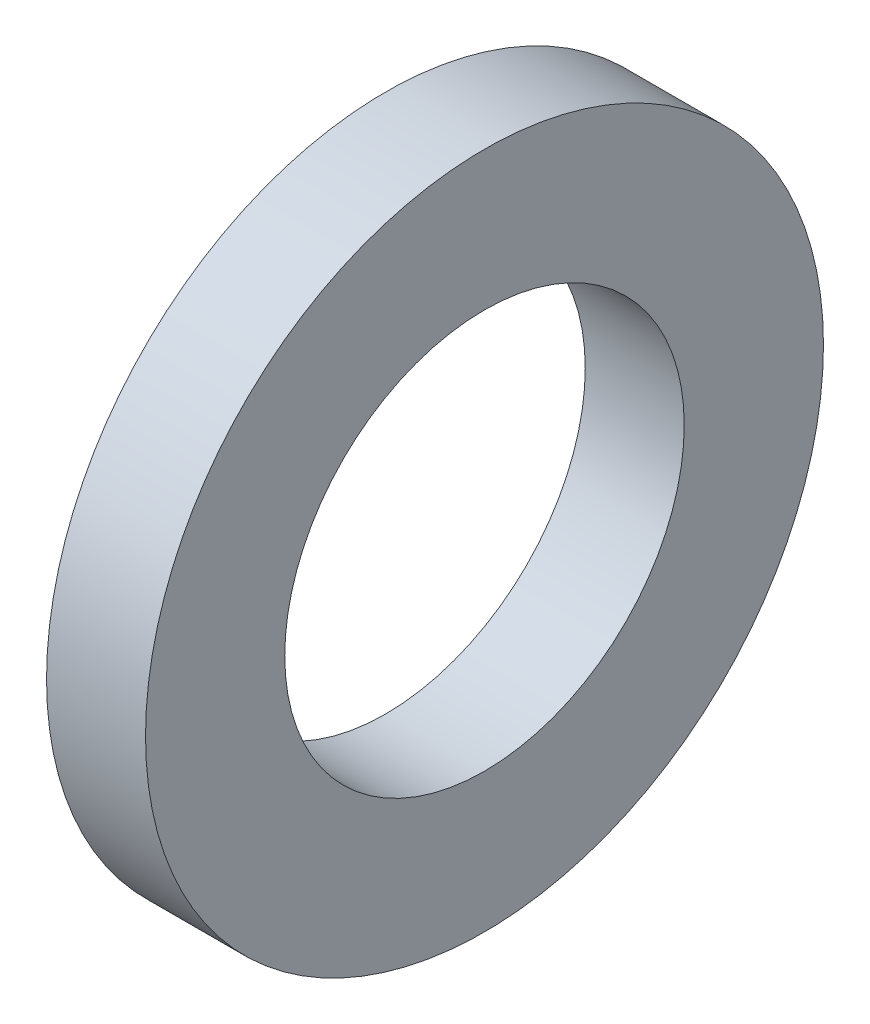
ISO-10303-21;
HEADER;
FILE_DESCRIPTION(('STEP AP214'),'2;1');
FILE_NAME('part.step','',(''),(''),'','','');
FILE_SCHEMA(('AUTOMOTIVE_DESIGN { 1 0 10303 214 1 1 1 1 }'));
ENDSEC;
DATA;
#1=APPLICATION_CONTEXT('core data for automotive mechanical design processes');
#2=APPLICATION_PROTOCOL_DEFINITION('international standard','automotive_design',2000,#1);
#3=PRODUCT_CONTEXT('',#1,'mechanical');
#4=PRODUCT('Part','Part','',(#3));
#5=PRODUCT_RELATED_PRODUCT_CATEGORY('part','',(#4));
#6=PRODUCT_DEFINITION_FORMATION('','',#4);
#7=PRODUCT_DEFINITION_CONTEXT('part definition',#1,'design');
#8=PRODUCT_DEFINITION('design','',#6,#7);
#9=PRODUCT_DEFINITION_SHAPE('','',#8);
#10=(LENGTH_UNIT() NAMED_UNIT(*) SI_UNIT(.MILLI.,.METRE.));
#11=(NAMED_UNIT(*) PLANE_ANGLE_UNIT() SI_UNIT($,.RADIAN.));
#12=(NAMED_UNIT(*) SI_UNIT($,.STERADIAN.) SOLID_ANGLE_UNIT());
#13=UNCERTAINTY_MEASURE_WITH_UNIT(LENGTH_MEASURE(1.E-05),#10,'distance_accuracy_value','');
#14=(GEOMETRIC_REPRESENTATION_CONTEXT(3) GLOBAL_UNCERTAINTY_ASSIGNED_CONTEXT((#13)) GLOBAL_UNIT_ASSIGNED_CONTEXT((#10,
#11,#12)) REPRESENTATION_CONTEXT('',''));
#15=CARTESIAN_POINT('',(0.,0.,0.));
#16=DIRECTION('',(0.,0.,1.));
#17=DIRECTION('',(1.,0.,0.));
#18=AXIS2_PLACEMENT_3D('',#15,#16,#17);
#19=CARTESIAN_POINT('',(1.29794,0.,0.));
#20=DIRECTION('',(1.,0.,0.));
#21=DIRECTION('',(0.,0.,-1.));
#22=AXIS2_PLACEMENT_3D('',#19,#20,#21);
#23=PLANE('',#22);
#24=CARTESIAN_POINT('',(1.29794,0.,0.));
#25=DIRECTION('',(1.,0.,0.));
#26=DIRECTION('',(0.,0.,-1.));
#27=AXIS2_PLACEMENT_3D('',#24,#25,#26);
#28=CIRCLE('',#27,8.89);
#29=CARTESIAN_POINT('',(1.29794,0.,-8.89));
#30=VERTEX_POINT('',#29);
#31=EDGE_CURVE('E10',#30,#30,#28,.T.);
#32=ORIENTED_EDGE('',*,*,#31,.T.);
#33=EDGE_LOOP('',(#32));
#34=FACE_BOUND('',#33,.T.);
#35=CARTESIAN_POINT('',(1.29794,0.,0.));
#36=DIRECTION('',(1.,0.,0.));
#37=DIRECTION('',(0.,0.,-1.));
#38=AXIS2_PLACEMENT_3D('',#35,#36,#37);
#39=CIRCLE('',#38,5.23875);
#40=CARTESIAN_POINT('',(1.29794,0.,-5.23875));
#41=VERTEX_POINT('',#40);
#42=EDGE_CURVE('E56',#41,#41,#39,.T.);
#43=ORIENTED_EDGE('',*,*,#42,.F.);
#44=EDGE_LOOP('',(#43));
#45=FACE_BOUND('',#44,.T.);
#46=ADVANCED_FACE('F43',(#34,#45),#23,.T.);
#47=CARTESIAN_POINT('',(-1.29794,0.,0.));
#48=DIRECTION('',(1.,0.,0.));
#49=DIRECTION('',(0.,0.,-1.));
#50=AXIS2_PLACEMENT_3D('',#47,#48,#49);
#51=PLANE('',#50);
#52=CARTESIAN_POINT('',(-1.29794,0.,0.));
#53=DIRECTION('',(1.,0.,0.));
#54=DIRECTION('',(0.,0.,-1.));
#55=AXIS2_PLACEMENT_3D('',#52,#53,#54);
#56=CIRCLE('',#55,8.89);
#57=CARTESIAN_POINT('',(-1.29794,0.,-8.89));
#58=VERTEX_POINT('',#57);
#59=EDGE_CURVE('E47',#58,#58,#56,.T.);
#60=ORIENTED_EDGE('',*,*,#59,.F.);
#61=EDGE_LOOP('',(#60));
#62=FACE_BOUND('',#61,.T.);
#63=CARTESIAN_POINT('',(-1.29794,0.,0.));
#64=DIRECTION('',(1.,0.,0.));
#65=DIRECTION('',(0.,0.,-1.));
#66=AXIS2_PLACEMENT_3D('',#63,#64,#65);
#67=CIRCLE('',#66,5.23875);
#68=CARTESIAN_POINT('',(-1.29794,0.,-5.23875));
#69=VERTEX_POINT('',#68);
#70=EDGE_CURVE('E58',#69,#69,#67,.T.);
#71=ORIENTED_EDGE('',*,*,#70,.T.);
#72=EDGE_LOOP('',(#71));
#73=FACE_BOUND('',#72,.T.);
#74=ADVANCED_FACE('F70',(#62,#73),#51,.F.);
#75=CARTESIAN_POINT('',(1.29794,0.,0.));
#76=DIRECTION('',(-1.,0.,0.));
#77=DIRECTION('',(0.,0.,1.));
#78=AXIS2_PLACEMENT_3D('',#75,#76,#77);
#79=CYLINDRICAL_SURFACE('',#78,8.89);
#80=ORIENTED_EDGE('',*,*,#31,.F.);
#81=EDGE_LOOP('',(#80));
#82=FACE_BOUND('',#81,.T.);
#83=ORIENTED_EDGE('',*,*,#59,.T.);
#84=EDGE_LOOP('',(#83));
#85=FACE_BOUND('',#84,.T.);
#86=ADVANCED_FACE('F45',(#82,#85),#79,.T.);
#87=CARTESIAN_POINT('',(1.29794,0.,0.));
#88=DIRECTION('',(-1.,0.,0.));
#89=DIRECTION('',(0.,0.,1.));
#90=AXIS2_PLACEMENT_3D('',#87,#88,#89);
#91=CYLINDRICAL_SURFACE('',#90,5.23875);
#92=ORIENTED_EDGE('',*,*,#42,.T.);
#93=EDGE_LOOP('',(#92));
#94=FACE_BOUND('',#93,.T.);
#95=ORIENTED_EDGE('',*,*,#70,.F.);
#96=EDGE_LOOP('',(#95));
#97=FACE_BOUND('',#96,.T.);
#98=ADVANCED_FACE('F66',(#94,#97),#91,.F.);
#99=CLOSED_SHELL('',(#46,#74,#86,#98));
#100=MANIFOLD_SOLID_BREP('B2',#99);
#101=ADVANCED_BREP_SHAPE_REPRESENTATION('',(#18,#100),#14);
#102=SHAPE_DEFINITION_REPRESENTATION(#9,#101);
ENDSEC;
END-ISO-10303-21;
